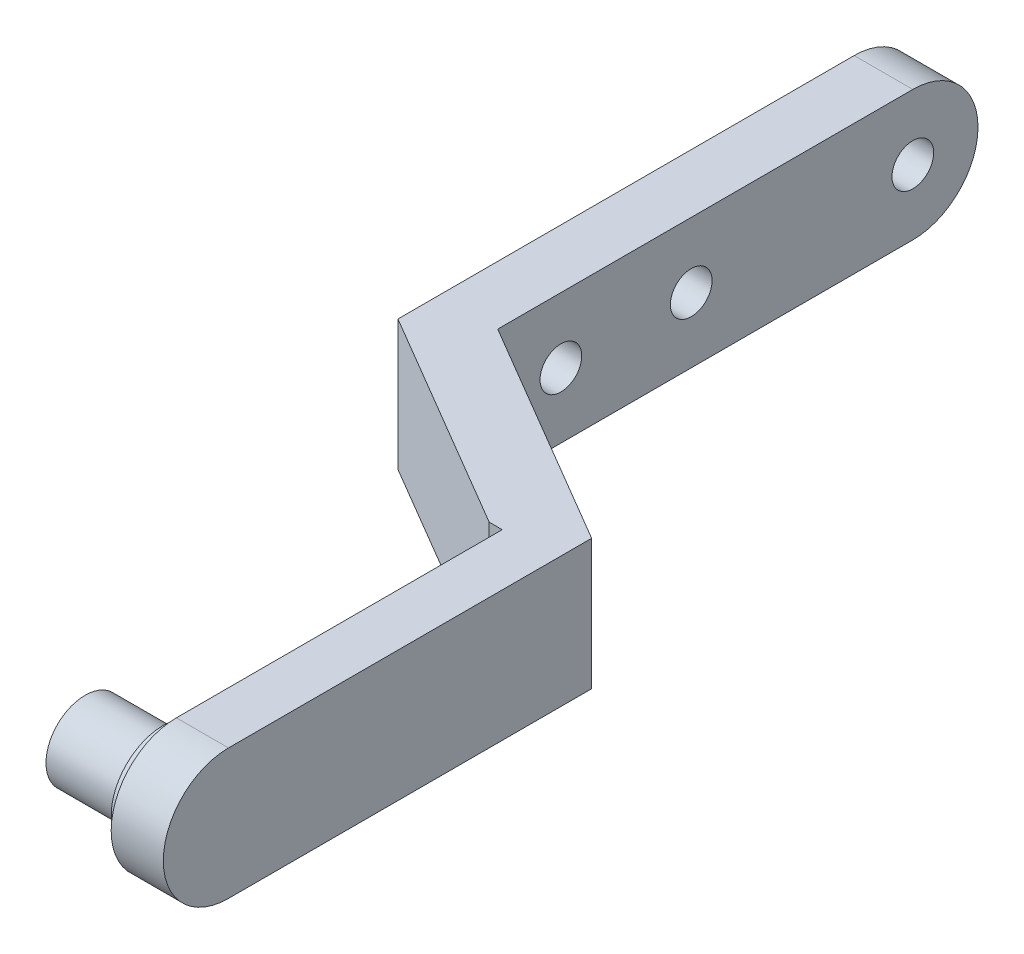
ISO-10303-21;
HEADER;
FILE_DESCRIPTION(('STEP AP214'),'2;1');
FILE_NAME('part.step','',(''),(''),'','','');
FILE_SCHEMA(('AUTOMOTIVE_DESIGN { 1 0 10303 214 1 1 1 1 }'));
ENDSEC;
DATA;
#1=APPLICATION_CONTEXT('core data for automotive mechanical design processes');
#2=APPLICATION_PROTOCOL_DEFINITION('international standard','automotive_design',2000,#1);
#3=PRODUCT_CONTEXT('',#1,'mechanical');
#4=PRODUCT('Part','Part','',(#3));
#5=PRODUCT_RELATED_PRODUCT_CATEGORY('part','',(#4));
#6=PRODUCT_DEFINITION_FORMATION('','',#4);
#7=PRODUCT_DEFINITION_CONTEXT('part definition',#1,'design');
#8=PRODUCT_DEFINITION('design','',#6,#7);
#9=PRODUCT_DEFINITION_SHAPE('','',#8);
#10=(LENGTH_UNIT() NAMED_UNIT(*) SI_UNIT(.MILLI.,.METRE.));
#11=(NAMED_UNIT(*) PLANE_ANGLE_UNIT() SI_UNIT($,.RADIAN.));
#12=(NAMED_UNIT(*) SI_UNIT($,.STERADIAN.) SOLID_ANGLE_UNIT());
#13=UNCERTAINTY_MEASURE_WITH_UNIT(LENGTH_MEASURE(1.E-05),#10,'distance_accuracy_value','');
#14=(GEOMETRIC_REPRESENTATION_CONTEXT(3) GLOBAL_UNCERTAINTY_ASSIGNED_CONTEXT((#13)) GLOBAL_UNIT_ASSIGNED_CONTEXT((#10,
#11,#12)) REPRESENTATION_CONTEXT('',''));
#15=CARTESIAN_POINT('',(0.,0.,0.));
#16=DIRECTION('',(0.,0.,1.));
#17=DIRECTION('',(1.,0.,0.));
#18=AXIS2_PLACEMENT_3D('',#15,#16,#17);
#19=CARTESIAN_POINT('',(0.,5.,-30.));
#20=DIRECTION('',(1.,0.,0.));
#21=DIRECTION('',(0.,0.,-1.));
#22=AXIS2_PLACEMENT_3D('',#19,#20,#21);
#23=PLANE('',#22);
#24=CARTESIAN_POINT('',(0.,0.,-5.));
#25=DIRECTION('',(1.,0.,0.));
#26=DIRECTION('',(0.,0.,-1.));
#27=AXIS2_PLACEMENT_3D('',#24,#25,#26);
#28=CIRCLE('',#27,3.);
#29=CARTESIAN_POINT('',(0.,0.,-8.00000000000001));
#30=VERTEX_POINT('',#29);
#31=EDGE_CURVE('E12',#30,#30,#28,.F.);
#32=ORIENTED_EDGE('',*,*,#31,.F.);
#33=EDGE_LOOP('',(#32));
#34=FACE_BOUND('',#33,.T.);
#35=CARTESIAN_POINT('',(0.,0.,-5.));
#36=DIRECTION('',(1.,0.,0.));
#37=DIRECTION('',(0.,0.,-1.));
#38=AXIS2_PLACEMENT_3D('',#35,#36,#37);
#39=CIRCLE('',#38,4.);
#40=CARTESIAN_POINT('',(0.,0.,-9.00000000000001));
#41=VERTEX_POINT('',#40);
#42=EDGE_CURVE('E50',#41,#41,#39,.F.);
#43=ORIENTED_EDGE('',*,*,#42,.T.);
#44=EDGE_LOOP('',(#43));
#45=FACE_BOUND('',#44,.T.);
#46=ADVANCED_FACE('F46',(#34,#45),#23,.F.);
#47=CARTESIAN_POINT('',(-6.,0.,-5.00000000000001));
#48=DIRECTION('',(1.,0.,0.));
#49=DIRECTION('',(0.,0.,-1.));
#50=AXIS2_PLACEMENT_3D('',#47,#48,#49);
#51=CYLINDRICAL_SURFACE('',#50,3.);
#52=CARTESIAN_POINT('',(-6.,0.,-5.00000000000001));
#53=DIRECTION('',(-1.,0.,0.));
#54=DIRECTION('',(0.,0.,1.));
#55=AXIS2_PLACEMENT_3D('',#52,#53,#54);
#56=CIRCLE('',#55,3.);
#57=CARTESIAN_POINT('',(-6.,0.,-2.));
#58=VERTEX_POINT('',#57);
#59=EDGE_CURVE('E290',#58,#58,#56,.T.);
#60=ORIENTED_EDGE('',*,*,#59,.F.);
#61=EDGE_LOOP('',(#60));
#62=FACE_BOUND('',#61,.T.);
#63=ORIENTED_EDGE('',*,*,#31,.T.);
#64=EDGE_LOOP('',(#63));
#65=FACE_BOUND('',#64,.T.);
#66=ADVANCED_FACE('F239',(#62,#65),#51,.T.);
#67=CARTESIAN_POINT('',(-6.,0.,-5.00000000000001));
#68=DIRECTION('',(-1.,0.,0.));
#69=DIRECTION('',(0.,0.,1.));
#70=AXIS2_PLACEMENT_3D('',#67,#68,#69);
#71=PLANE('',#70);
#72=ORIENTED_EDGE('',*,*,#59,.T.);
#73=EDGE_LOOP('',(#72));
#74=FACE_BOUND('',#73,.T.);
#75=ADVANCED_FACE('F247',(#74),#71,.T.);
#76=CARTESIAN_POINT('',(-17.0000000000001,0.,-5.00000000000001));
#77=DIRECTION('',(1.,0.,0.));
#78=DIRECTION('',(0.,0.,-1.));
#79=AXIS2_PLACEMENT_3D('',#76,#77,#78);
#80=CYLINDRICAL_SURFACE('',#79,4.);
#81=CARTESIAN_POINT('',(1.,0.,-5.));
#82=DIRECTION('',(-1.,0.,0.));
#83=DIRECTION('',(0.,0.,1.));
#84=AXIS2_PLACEMENT_3D('',#81,#82,#83);
#85=CIRCLE('',#84,4.);
#86=CARTESIAN_POINT('',(1.,0.,-1.));
#87=VERTEX_POINT('',#86);
#88=EDGE_CURVE('E128',#87,#87,#85,.T.);
#89=ORIENTED_EDGE('',*,*,#88,.T.);
#90=EDGE_LOOP('',(#89));
#91=FACE_BOUND('',#90,.T.);
#92=ORIENTED_EDGE('',*,*,#42,.F.);
#93=EDGE_LOOP('',(#92));
#94=FACE_BOUND('',#93,.T.);
#95=ADVANCED_FACE('F352',(#91,#94),#80,.T.);
#96=CARTESIAN_POINT('',(-17.0000000000001,5.,-30.));
#97=DIRECTION('',(0.,0.,1.));
#98=DIRECTION('',(1.,0.,0.));
#99=AXIS2_PLACEMENT_3D('',#96,#97,#98);
#100=PLANE('',#99);
#101=DIRECTION('',(0.,-1.,0.));
#102=VECTOR('',#101,1.);
#103=CARTESIAN_POINT('',(0.,5.,-30.));
#104=LINE('',#103,#102);
#105=CARTESIAN_POINT('',(0.,5.,-30.));
#106=VERTEX_POINT('',#105);
#107=CARTESIAN_POINT('',(0.,-5.,-30.));
#108=VERTEX_POINT('',#107);
#109=EDGE_CURVE('E196',#106,#108,#104,.T.);
#110=ORIENTED_EDGE('',*,*,#109,.T.);
#111=DIRECTION('',(1.,0.,0.));
#112=VECTOR('',#111,1.);
#113=CARTESIAN_POINT('',(-17.0000000000001,-5.,-30.));
#114=LINE('',#113,#112);
#115=CARTESIAN_POINT('',(1.,-5.,-30.));
#116=VERTEX_POINT('',#115);
#117=EDGE_CURVE('E280',#108,#116,#114,.T.);
#118=ORIENTED_EDGE('',*,*,#117,.T.);
#119=DIRECTION('',(0.,-1.,0.));
#120=VECTOR('',#119,1.);
#121=CARTESIAN_POINT('',(1.,5.,-30.));
#122=LINE('',#121,#120);
#123=CARTESIAN_POINT('',(1.,5.,-30.));
#124=VERTEX_POINT('',#123);
#125=EDGE_CURVE('E137',#124,#116,#122,.T.);
#126=ORIENTED_EDGE('',*,*,#125,.F.);
#127=DIRECTION('',(1.,0.,0.));
#128=VECTOR('',#127,1.);
#129=CARTESIAN_POINT('',(-17.0000000000001,5.,-30.));
#130=LINE('',#129,#128);
#131=EDGE_CURVE('E135',#106,#124,#130,.T.);
#132=ORIENTED_EDGE('',*,*,#131,.F.);
#133=EDGE_LOOP('',(#110,#118,#126,#132));
#134=FACE_BOUND('',#133,.T.);
#135=ADVANCED_FACE('F284',(#134),#100,.T.);
#136=CARTESIAN_POINT('',(1.,0.,-5.));
#137=DIRECTION('',(-1.,0.,0.));
#138=DIRECTION('',(0.,0.,1.));
#139=AXIS2_PLACEMENT_3D('',#136,#137,#138);
#140=PLANE('',#139);
#141=ORIENTED_EDGE('',*,*,#88,.F.);
#142=EDGE_LOOP('',(#141));
#143=FACE_BOUND('',#142,.T.);
#144=CARTESIAN_POINT('',(1.,0.,-5.));
#145=DIRECTION('',(-1.,0.,0.));
#146=DIRECTION('',(0.,0.,1.));
#147=AXIS2_PLACEMENT_3D('',#144,#145,#146);
#148=CIRCLE('',#147,5.);
#149=CARTESIAN_POINT('',(1.,-5.,-5.));
#150=VERTEX_POINT('',#149);
#151=CARTESIAN_POINT('',(1.,5.,-5.));
#152=VERTEX_POINT('',#151);
#153=EDGE_CURVE('E119',#150,#152,#148,.T.);
#154=ORIENTED_EDGE('',*,*,#153,.T.);
#155=DIRECTION('',(0.,0.,-1.));
#156=VECTOR('',#155,1.);
#157=CARTESIAN_POINT('',(1.,5.,-5.));
#158=LINE('',#157,#156);
#159=EDGE_CURVE('E122',#152,#124,#158,.T.);
#160=ORIENTED_EDGE('',*,*,#159,.T.);
#161=ORIENTED_EDGE('',*,*,#125,.T.);
#162=DIRECTION('',(0.,0.,1.));
#163=VECTOR('',#162,1.);
#164=CARTESIAN_POINT('',(1.,-5.,-30.));
#165=LINE('',#164,#163);
#166=EDGE_CURVE('E63',#116,#150,#165,.T.);
#167=ORIENTED_EDGE('',*,*,#166,.T.);
#168=EDGE_LOOP('',(#154,#160,#161,#167));
#169=FACE_BOUND('',#168,.T.);
#170=ADVANCED_FACE('F121',(#143,#169),#140,.T.);
#171=CARTESIAN_POINT('',(-17.,0.,-48.));
#172=DIRECTION('',(1.,0.,0.));
#173=DIRECTION('',(0.,0.,-1.));
#174=AXIS2_PLACEMENT_3D('',#171,#172,#173);
#175=CYLINDRICAL_SURFACE('',#174,1.6);
#176=CARTESIAN_POINT('',(-17.,0.,-48.));
#177=DIRECTION('',(1.,0.,0.));
#178=DIRECTION('',(0.,0.,-1.));
#179=AXIS2_PLACEMENT_3D('',#176,#177,#178);
#180=CIRCLE('',#179,1.6);
#181=CARTESIAN_POINT('',(-17.,0.,-49.6));
#182=VERTEX_POINT('',#181);
#183=EDGE_CURVE('E274',#182,#182,#180,.T.);
#184=CARTESIAN_POINT('',(-12.5,0.,-48.));
#185=DIRECTION('',(-1.,0.,0.));
#186=DIRECTION('',(0.,0.,1.));
#187=AXIS2_PLACEMENT_3D('',#184,#185,#186);
#188=CIRCLE('',#187,1.6);
#189=CARTESIAN_POINT('',(-12.5,0.,-49.6));
#190=VERTEX_POINT('',#189);
#191=EDGE_CURVE('E299',#190,#190,#188,.T.);
#192=CARTESIAN_POINT('',(-17.,0.,-49.6));
#193=CARTESIAN_POINT('',(-16.953125,0.,-49.6));
#194=CARTESIAN_POINT('',(-16.90625,0.,-49.6));
#195=CARTESIAN_POINT('',(-16.8125,0.,-49.6));
#196=CARTESIAN_POINT('',(-16.765625,0.,-49.6));
#197=CARTESIAN_POINT('',(-16.671875,0.,-49.6));
#198=CARTESIAN_POINT('',(-16.625,0.,-49.6));
#199=CARTESIAN_POINT('',(-16.53125,0.,-49.6));
#200=CARTESIAN_POINT('',(-16.484375,0.,-49.6));
#201=CARTESIAN_POINT('',(-16.390625,0.,-49.6));
#202=CARTESIAN_POINT('',(-16.34375,0.,-49.6));
#203=CARTESIAN_POINT('',(-16.25,0.,-49.6));
#204=CARTESIAN_POINT('',(-16.203125,0.,-49.6));
#205=CARTESIAN_POINT('',(-16.109375,0.,-49.6));
#206=CARTESIAN_POINT('',(-16.0625,0.,-49.6));
#207=CARTESIAN_POINT('',(-15.96875,0.,-49.6));
#208=CARTESIAN_POINT('',(-15.921875,0.,-49.6));
#209=CARTESIAN_POINT('',(-15.828125,0.,-49.6));
#210=CARTESIAN_POINT('',(-15.78125,0.,-49.6));
#211=CARTESIAN_POINT('',(-15.6875,0.,-49.6));
#212=CARTESIAN_POINT('',(-15.640625,0.,-49.6));
#213=CARTESIAN_POINT('',(-15.546875,0.,-49.6));
#214=CARTESIAN_POINT('',(-15.5,0.,-49.6));
#215=CARTESIAN_POINT('',(-15.40625,0.,-49.6));
#216=CARTESIAN_POINT('',(-15.359375,0.,-49.6));
#217=CARTESIAN_POINT('',(-15.265625,0.,-49.6));
#218=CARTESIAN_POINT('',(-15.21875,0.,-49.6));
#219=CARTESIAN_POINT('',(-15.125,0.,-49.6));
#220=CARTESIAN_POINT('',(-15.078125,0.,-49.6));
#221=CARTESIAN_POINT('',(-14.984375,0.,-49.6));
#222=CARTESIAN_POINT('',(-14.9375,0.,-49.6));
#223=CARTESIAN_POINT('',(-14.84375,0.,-49.6));
#224=CARTESIAN_POINT('',(-14.796875,0.,-49.6));
#225=CARTESIAN_POINT('',(-14.703125,0.,-49.6));
#226=CARTESIAN_POINT('',(-14.65625,0.,-49.6));
#227=CARTESIAN_POINT('',(-14.5625,0.,-49.6));
#228=CARTESIAN_POINT('',(-14.515625,0.,-49.6));
#229=CARTESIAN_POINT('',(-14.421875,0.,-49.6));
#230=CARTESIAN_POINT('',(-14.375,0.,-49.6));
#231=CARTESIAN_POINT('',(-14.28125,0.,-49.6));
#232=CARTESIAN_POINT('',(-14.234375,0.,-49.6));
#233=CARTESIAN_POINT('',(-14.140625,0.,-49.6));
#234=CARTESIAN_POINT('',(-14.09375,0.,-49.6));
#235=CARTESIAN_POINT('',(-14.,0.,-49.6));
#236=CARTESIAN_POINT('',(-13.953125,0.,-49.6));
#237=CARTESIAN_POINT('',(-13.859375,0.,-49.6));
#238=CARTESIAN_POINT('',(-13.8125,0.,-49.6));
#239=CARTESIAN_POINT('',(-13.71875,0.,-49.6));
#240=CARTESIAN_POINT('',(-13.671875,0.,-49.6));
#241=CARTESIAN_POINT('',(-13.578125,0.,-49.6));
#242=CARTESIAN_POINT('',(-13.53125,0.,-49.6));
#243=CARTESIAN_POINT('',(-13.4375,0.,-49.6));
#244=CARTESIAN_POINT('',(-13.390625,0.,-49.6));
#245=CARTESIAN_POINT('',(-13.296875,0.,-49.6));
#246=CARTESIAN_POINT('',(-13.25,0.,-49.6));
#247=CARTESIAN_POINT('',(-13.15625,0.,-49.6));
#248=CARTESIAN_POINT('',(-13.109375,0.,-49.6));
#249=CARTESIAN_POINT('',(-13.015625,0.,-49.6));
#250=CARTESIAN_POINT('',(-12.96875,0.,-49.6));
#251=CARTESIAN_POINT('',(-12.875,0.,-49.6));
#252=CARTESIAN_POINT('',(-12.828125,0.,-49.6));
#253=CARTESIAN_POINT('',(-12.734375,0.,-49.6));
#254=CARTESIAN_POINT('',(-12.6875,0.,-49.6));
#255=CARTESIAN_POINT('',(-12.59375,0.,-49.6));
#256=CARTESIAN_POINT('',(-12.546875,0.,-49.6));
#257=CARTESIAN_POINT('',(-12.5,0.,-49.6));
#258=B_SPLINE_CURVE_WITH_KNOTS('',3,(#192,#193,#194,#195,#196,#197,#198,#199,#200,#201,#202,
#203,#204,#205,#206,#207,#208,#209,#210,#211,#212,#213,#214,#215,#216,#217,#218,#219,#220,#221,
#222,#223,#224,#225,#226,#227,#228,#229,#230,#231,#232,#233,#234,#235,#236,#237,#238,#239,#240,
#241,#242,#243,#244,#245,#246,#247,#248,#249,#250,#251,#252,#253,#254,#255,#256,#257),
.UNSPECIFIED.,.F.,.F.,(4,2,2,2,2,2,2,2,2,2,2,2,2,2,2,2,2,2,2,2,2,2,2,2,2,2,2,2,2,2,2,2,4),(0.,
0.140624999999998,0.28125,0.421875000000002,0.562500000000004,0.703125000000006,
0.843750000000004,0.984375000000006,1.12500000000001,1.26562500000001,1.40625000000001,
1.54687500000001,1.68750000000001,1.82812500000001,1.96875000000002,2.10937500000002,
2.25000000000002,2.39062500000002,2.53125000000002,2.67187500000002,2.81250000000002,
2.95312500000003,3.09375000000003,3.23437500000003,3.37500000000003,3.51562500000003,
3.65625000000003,3.79687500000003,3.93750000000003,4.07812500000003,4.21875000000003,
4.35937500000004,4.50000000000004),.UNSPECIFIED.);
#259=EDGE_CURVE('BSEAM321',#182,#190,#258,.T.);
#260=ORIENTED_EDGE('',*,*,#183,.F.);
#261=ORIENTED_EDGE('',*,*,#191,.F.);
#262=ORIENTED_EDGE('',*,*,#259,.T.);
#263=ORIENTED_EDGE('',*,*,#259,.F.);
#264=EDGE_LOOP('',(#260,#262,#261,#263));
#265=FACE_BOUND('',#264,.T.);
#266=ADVANCED_FACE('F321',(#265),#175,.F.);
#267=CARTESIAN_POINT('',(-17.,0.,-58.));
#268=DIRECTION('',(1.,0.,0.));
#269=DIRECTION('',(0.,0.,-1.));
#270=AXIS2_PLACEMENT_3D('',#267,#268,#269);
#271=CYLINDRICAL_SURFACE('',#270,1.60000000000001);
#272=CARTESIAN_POINT('',(-17.,0.,-58.));
#273=DIRECTION('',(1.,0.,0.));
#274=DIRECTION('',(0.,0.,-1.));
#275=AXIS2_PLACEMENT_3D('',#272,#273,#274);
#276=CIRCLE('',#275,1.60000000000001);
#277=CARTESIAN_POINT('',(-17.,0.,-59.6));
#278=VERTEX_POINT('',#277);
#279=EDGE_CURVE('E270',#278,#278,#276,.T.);
#280=CARTESIAN_POINT('',(-12.5,0.,-58.));
#281=DIRECTION('',(-1.,0.,0.));
#282=DIRECTION('',(0.,0.,1.));
#283=AXIS2_PLACEMENT_3D('',#280,#281,#282);
#284=CIRCLE('',#283,1.60000000000001);
#285=CARTESIAN_POINT('',(-12.5,0.,-59.6));
#286=VERTEX_POINT('',#285);
#287=EDGE_CURVE('E307',#286,#286,#284,.T.);
#288=CARTESIAN_POINT('',(-17.,0.,-59.6));
#289=CARTESIAN_POINT('',(-16.953125,0.,-59.6));
#290=CARTESIAN_POINT('',(-16.90625,0.,-59.6));
#291=CARTESIAN_POINT('',(-16.8125,0.,-59.6));
#292=CARTESIAN_POINT('',(-16.765625,0.,-59.6));
#293=CARTESIAN_POINT('',(-16.671875,0.,-59.6));
#294=CARTESIAN_POINT('',(-16.625,0.,-59.6));
#295=CARTESIAN_POINT('',(-16.53125,0.,-59.6));
#296=CARTESIAN_POINT('',(-16.484375,0.,-59.6));
#297=CARTESIAN_POINT('',(-16.390625,0.,-59.6));
#298=CARTESIAN_POINT('',(-16.34375,0.,-59.6));
#299=CARTESIAN_POINT('',(-16.25,0.,-59.6));
#300=CARTESIAN_POINT('',(-16.203125,0.,-59.6));
#301=CARTESIAN_POINT('',(-16.109375,0.,-59.6));
#302=CARTESIAN_POINT('',(-16.0625,0.,-59.6));
#303=CARTESIAN_POINT('',(-15.96875,0.,-59.6));
#304=CARTESIAN_POINT('',(-15.921875,0.,-59.6));
#305=CARTESIAN_POINT('',(-15.828125,0.,-59.6));
#306=CARTESIAN_POINT('',(-15.78125,0.,-59.6));
#307=CARTESIAN_POINT('',(-15.6875,0.,-59.6));
#308=CARTESIAN_POINT('',(-15.640625,0.,-59.6));
#309=CARTESIAN_POINT('',(-15.546875,0.,-59.6));
#310=CARTESIAN_POINT('',(-15.5,0.,-59.6));
#311=CARTESIAN_POINT('',(-15.40625,0.,-59.6));
#312=CARTESIAN_POINT('',(-15.359375,0.,-59.6));
#313=CARTESIAN_POINT('',(-15.265625,0.,-59.6));
#314=CARTESIAN_POINT('',(-15.21875,0.,-59.6));
#315=CARTESIAN_POINT('',(-15.125,0.,-59.6));
#316=CARTESIAN_POINT('',(-15.078125,0.,-59.6));
#317=CARTESIAN_POINT('',(-14.984375,0.,-59.6));
#318=CARTESIAN_POINT('',(-14.9375,0.,-59.6));
#319=CARTESIAN_POINT('',(-14.84375,0.,-59.6));
#320=CARTESIAN_POINT('',(-14.796875,0.,-59.6));
#321=CARTESIAN_POINT('',(-14.703125,0.,-59.6));
#322=CARTESIAN_POINT('',(-14.65625,0.,-59.6));
#323=CARTESIAN_POINT('',(-14.5625,0.,-59.6));
#324=CARTESIAN_POINT('',(-14.515625,0.,-59.6));
#325=CARTESIAN_POINT('',(-14.421875,0.,-59.6));
#326=CARTESIAN_POINT('',(-14.375,0.,-59.6));
#327=CARTESIAN_POINT('',(-14.28125,0.,-59.6));
#328=CARTESIAN_POINT('',(-14.234375,0.,-59.6));
#329=CARTESIAN_POINT('',(-14.140625,0.,-59.6));
#330=CARTESIAN_POINT('',(-14.09375,0.,-59.6));
#331=CARTESIAN_POINT('',(-14.,0.,-59.6));
#332=CARTESIAN_POINT('',(-13.953125,0.,-59.6));
#333=CARTESIAN_POINT('',(-13.859375,0.,-59.6));
#334=CARTESIAN_POINT('',(-13.8125,0.,-59.6));
#335=CARTESIAN_POINT('',(-13.71875,0.,-59.6));
#336=CARTESIAN_POINT('',(-13.671875,0.,-59.6));
#337=CARTESIAN_POINT('',(-13.578125,0.,-59.6));
#338=CARTESIAN_POINT('',(-13.53125,0.,-59.6));
#339=CARTESIAN_POINT('',(-13.4375,0.,-59.6));
#340=CARTESIAN_POINT('',(-13.390625,0.,-59.6));
#341=CARTESIAN_POINT('',(-13.296875,0.,-59.6));
#342=CARTESIAN_POINT('',(-13.25,0.,-59.6));
#343=CARTESIAN_POINT('',(-13.15625,0.,-59.6));
#344=CARTESIAN_POINT('',(-13.109375,0.,-59.6));
#345=CARTESIAN_POINT('',(-13.015625,0.,-59.6));
#346=CARTESIAN_POINT('',(-12.96875,0.,-59.6));
#347=CARTESIAN_POINT('',(-12.875,0.,-59.6));
#348=CARTESIAN_POINT('',(-12.828125,0.,-59.6));
#349=CARTESIAN_POINT('',(-12.734375,0.,-59.6));
#350=CARTESIAN_POINT('',(-12.6875,0.,-59.6));
#351=CARTESIAN_POINT('',(-12.59375,0.,-59.6));
#352=CARTESIAN_POINT('',(-12.546875,0.,-59.6));
#353=CARTESIAN_POINT('',(-12.5,0.,-59.6));
#354=B_SPLINE_CURVE_WITH_KNOTS('',3,(#288,#289,#290,#291,#292,#293,#294,#295,#296,#297,#298,
#299,#300,#301,#302,#303,#304,#305,#306,#307,#308,#309,#310,#311,#312,#313,#314,#315,#316,#317,
#318,#319,#320,#321,#322,#323,#324,#325,#326,#327,#328,#329,#330,#331,#332,#333,#334,#335,#336,
#337,#338,#339,#340,#341,#342,#343,#344,#345,#346,#347,#348,#349,#350,#351,#352,#353),
.UNSPECIFIED.,.F.,.F.,(4,2,2,2,2,2,2,2,2,2,2,2,2,2,2,2,2,2,2,2,2,2,2,2,2,2,2,2,2,2,2,2,4),(0.,
0.140624999999998,0.28125,0.421875000000002,0.562500000000004,0.703125000000006,
0.843750000000004,0.984375000000006,1.12500000000001,1.26562500000001,1.40625000000001,
1.54687500000001,1.68750000000001,1.82812500000001,1.96875000000002,2.10937500000002,
2.25000000000002,2.39062500000002,2.53125000000002,2.67187500000002,2.81250000000002,
2.95312500000003,3.09375000000003,3.23437500000003,3.37500000000003,3.51562500000003,
3.65625000000003,3.79687500000003,3.93750000000003,4.07812500000003,4.21875000000003,
4.35937500000004,4.50000000000004),.UNSPECIFIED.);
#355=EDGE_CURVE('BSEAM315',#278,#286,#354,.T.);
#356=ORIENTED_EDGE('',*,*,#279,.F.);
#357=ORIENTED_EDGE('',*,*,#287,.F.);
#358=ORIENTED_EDGE('',*,*,#355,.T.);
#359=ORIENTED_EDGE('',*,*,#355,.F.);
#360=EDGE_LOOP('',(#356,#358,#357,#359));
#361=FACE_BOUND('',#360,.T.);
#362=ADVANCED_FACE('F315',(#361),#271,.F.);
#363=CARTESIAN_POINT('',(-17.,0.,-75.));
#364=DIRECTION('',(1.,0.,0.));
#365=DIRECTION('',(0.,0.,-1.));
#366=AXIS2_PLACEMENT_3D('',#363,#364,#365);
#367=CYLINDRICAL_SURFACE('',#366,1.60000000000001);
#368=CARTESIAN_POINT('',(-17.,0.,-75.));
#369=DIRECTION('',(1.,0.,0.));
#370=DIRECTION('',(0.,0.,-1.));
#371=AXIS2_PLACEMENT_3D('',#368,#369,#370);
#372=CIRCLE('',#371,1.60000000000001);
#373=CARTESIAN_POINT('',(-17.,0.,-76.6));
#374=VERTEX_POINT('',#373);
#375=EDGE_CURVE('E266',#374,#374,#372,.T.);
#376=CARTESIAN_POINT('',(-12.5,0.,-75.));
#377=DIRECTION('',(-1.,0.,0.));
#378=DIRECTION('',(0.,0.,1.));
#379=AXIS2_PLACEMENT_3D('',#376,#377,#378);
#380=CIRCLE('',#379,1.60000000000001);
#381=CARTESIAN_POINT('',(-12.5,0.,-76.6));
#382=VERTEX_POINT('',#381);
#383=EDGE_CURVE('E214',#382,#382,#380,.T.);
#384=CARTESIAN_POINT('',(-17.,0.,-76.6));
#385=CARTESIAN_POINT('',(-16.953125,0.,-76.6));
#386=CARTESIAN_POINT('',(-16.90625,0.,-76.6));
#387=CARTESIAN_POINT('',(-16.8125,0.,-76.6));
#388=CARTESIAN_POINT('',(-16.765625,0.,-76.6));
#389=CARTESIAN_POINT('',(-16.671875,0.,-76.6));
#390=CARTESIAN_POINT('',(-16.625,0.,-76.6));
#391=CARTESIAN_POINT('',(-16.53125,0.,-76.6));
#392=CARTESIAN_POINT('',(-16.484375,0.,-76.6));
#393=CARTESIAN_POINT('',(-16.390625,0.,-76.6));
#394=CARTESIAN_POINT('',(-16.34375,0.,-76.6));
#395=CARTESIAN_POINT('',(-16.25,0.,-76.6));
#396=CARTESIAN_POINT('',(-16.203125,0.,-76.6));
#397=CARTESIAN_POINT('',(-16.109375,0.,-76.6));
#398=CARTESIAN_POINT('',(-16.0625,0.,-76.6));
#399=CARTESIAN_POINT('',(-15.96875,0.,-76.6));
#400=CARTESIAN_POINT('',(-15.921875,0.,-76.6));
#401=CARTESIAN_POINT('',(-15.828125,0.,-76.6));
#402=CARTESIAN_POINT('',(-15.78125,0.,-76.6));
#403=CARTESIAN_POINT('',(-15.6875,0.,-76.6));
#404=CARTESIAN_POINT('',(-15.640625,0.,-76.6));
#405=CARTESIAN_POINT('',(-15.546875,0.,-76.6));
#406=CARTESIAN_POINT('',(-15.5,0.,-76.6));
#407=CARTESIAN_POINT('',(-15.40625,0.,-76.6));
#408=CARTESIAN_POINT('',(-15.359375,0.,-76.6));
#409=CARTESIAN_POINT('',(-15.265625,0.,-76.6));
#410=CARTESIAN_POINT('',(-15.21875,0.,-76.6));
#411=CARTESIAN_POINT('',(-15.125,0.,-76.6));
#412=CARTESIAN_POINT('',(-15.078125,0.,-76.6));
#413=CARTESIAN_POINT('',(-14.984375,0.,-76.6));
#414=CARTESIAN_POINT('',(-14.9375,0.,-76.6));
#415=CARTESIAN_POINT('',(-14.84375,0.,-76.6));
#416=CARTESIAN_POINT('',(-14.796875,0.,-76.6));
#417=CARTESIAN_POINT('',(-14.703125,0.,-76.6));
#418=CARTESIAN_POINT('',(-14.65625,0.,-76.6));
#419=CARTESIAN_POINT('',(-14.5625,0.,-76.6));
#420=CARTESIAN_POINT('',(-14.515625,0.,-76.6));
#421=CARTESIAN_POINT('',(-14.421875,0.,-76.6));
#422=CARTESIAN_POINT('',(-14.375,0.,-76.6));
#423=CARTESIAN_POINT('',(-14.28125,0.,-76.6));
#424=CARTESIAN_POINT('',(-14.234375,0.,-76.6));
#425=CARTESIAN_POINT('',(-14.140625,0.,-76.6));
#426=CARTESIAN_POINT('',(-14.09375,0.,-76.6));
#427=CARTESIAN_POINT('',(-14.,0.,-76.6));
#428=CARTESIAN_POINT('',(-13.953125,0.,-76.6));
#429=CARTESIAN_POINT('',(-13.859375,0.,-76.6));
#430=CARTESIAN_POINT('',(-13.8125,0.,-76.6));
#431=CARTESIAN_POINT('',(-13.71875,0.,-76.6));
#432=CARTESIAN_POINT('',(-13.671875,0.,-76.6));
#433=CARTESIAN_POINT('',(-13.578125,0.,-76.6));
#434=CARTESIAN_POINT('',(-13.53125,0.,-76.6));
#435=CARTESIAN_POINT('',(-13.4375,0.,-76.6));
#436=CARTESIAN_POINT('',(-13.390625,0.,-76.6));
#437=CARTESIAN_POINT('',(-13.296875,0.,-76.6));
#438=CARTESIAN_POINT('',(-13.25,0.,-76.6));
#439=CARTESIAN_POINT('',(-13.15625,0.,-76.6));
#440=CARTESIAN_POINT('',(-13.109375,0.,-76.6));
#441=CARTESIAN_POINT('',(-13.015625,0.,-76.6));
#442=CARTESIAN_POINT('',(-12.96875,0.,-76.6));
#443=CARTESIAN_POINT('',(-12.875,0.,-76.6));
#444=CARTESIAN_POINT('',(-12.828125,0.,-76.6));
#445=CARTESIAN_POINT('',(-12.734375,0.,-76.6));
#446=CARTESIAN_POINT('',(-12.6875,0.,-76.6));
#447=CARTESIAN_POINT('',(-12.59375,0.,-76.6));
#448=CARTESIAN_POINT('',(-12.546875,0.,-76.6));
#449=CARTESIAN_POINT('',(-12.5,0.,-76.6));
#450=B_SPLINE_CURVE_WITH_KNOTS('',3,(#384,#385,#386,#387,#388,#389,#390,#391,#392,#393,#394,
#395,#396,#397,#398,#399,#400,#401,#402,#403,#404,#405,#406,#407,#408,#409,#410,#411,#412,#413,
#414,#415,#416,#417,#418,#419,#420,#421,#422,#423,#424,#425,#426,#427,#428,#429,#430,#431,#432,
#433,#434,#435,#436,#437,#438,#439,#440,#441,#442,#443,#444,#445,#446,#447,#448,#449),
.UNSPECIFIED.,.F.,.F.,(4,2,2,2,2,2,2,2,2,2,2,2,2,2,2,2,2,2,2,2,2,2,2,2,2,2,2,2,2,2,2,2,4),(0.,
0.140624999999998,0.28125,0.421875000000002,0.562500000000004,0.703125000000006,
0.843750000000004,0.984375000000006,1.12500000000001,1.26562500000001,1.40625000000001,
1.54687500000001,1.68750000000001,1.82812500000001,1.96875000000002,2.10937500000002,
2.25000000000002,2.39062500000002,2.53125000000002,2.67187500000002,2.81250000000002,
2.95312500000003,3.09375000000003,3.23437500000003,3.37500000000003,3.51562500000003,
3.65625000000003,3.79687500000003,3.93750000000003,4.07812500000003,4.21875000000003,
4.35937500000004,4.50000000000004),.UNSPECIFIED.);
#451=EDGE_CURVE('BSEAM234',#374,#382,#450,.T.);
#452=ORIENTED_EDGE('',*,*,#375,.F.);
#453=ORIENTED_EDGE('',*,*,#383,.F.);
#454=ORIENTED_EDGE('',*,*,#451,.T.);
#455=ORIENTED_EDGE('',*,*,#451,.F.);
#456=EDGE_LOOP('',(#452,#454,#453,#455));
#457=FACE_BOUND('',#456,.T.);
#458=ADVANCED_FACE('F234',(#457),#367,.F.);
#459=CARTESIAN_POINT('',(-12.5,5.,-43.1538479186224));
#460=DIRECTION('',(-0.507020126563393,0.,0.86193421515777));
#461=DIRECTION('',(0.86193421515777,0.,0.507020126563393));
#462=AXIS2_PLACEMENT_3D('',#459,#460,#461);
#463=PLANE('',#462);
#464=DIRECTION('',(-0.86193421515777,0.,-0.507020126563393));
#465=VECTOR('',#464,1.);
#466=CARTESIAN_POINT('',(-12.5,-5.,-43.1538479186224));
#467=LINE('',#466,#465);
#468=CARTESIAN_POINT('',(5.,-5.,-32.8597302715635));
#469=VERTEX_POINT('',#468);
#470=CARTESIAN_POINT('',(-12.5,-5.,-43.1538479186224));
#471=VERTEX_POINT('',#470);
#472=EDGE_CURVE('E148',#469,#471,#467,.T.);
#473=ORIENTED_EDGE('',*,*,#472,.T.);
#474=DIRECTION('',(0.,-1.,0.));
#475=VECTOR('',#474,1.);
#476=CARTESIAN_POINT('',(-12.5,5.,-43.1538479186224));
#477=LINE('',#476,#475);
#478=CARTESIAN_POINT('',(-12.5,5.,-43.1538479186224));
#479=VERTEX_POINT('',#478);
#480=EDGE_CURVE('E203',#479,#471,#477,.T.);
#481=ORIENTED_EDGE('',*,*,#480,.F.);
#482=DIRECTION('',(-0.86193421515777,0.,-0.507020126563393));
#483=VECTOR('',#482,1.);
#484=CARTESIAN_POINT('',(-12.5,5.,-43.1538479186224));
#485=LINE('',#484,#483);
#486=CARTESIAN_POINT('',(5.,5.,-32.8597302715635));
#487=VERTEX_POINT('',#486);
#488=EDGE_CURVE('E158',#487,#479,#485,.T.);
#489=ORIENTED_EDGE('',*,*,#488,.F.);
#490=DIRECTION('',(0.,-1.,0.));
#491=VECTOR('',#490,1.);
#492=CARTESIAN_POINT('',(5.,5.,-32.8597302715635));
#493=LINE('',#492,#491);
#494=EDGE_CURVE('E176',#487,#469,#493,.T.);
#495=ORIENTED_EDGE('',*,*,#494,.T.);
#496=EDGE_LOOP('',(#473,#481,#489,#495));
#497=FACE_BOUND('',#496,.T.);
#498=ADVANCED_FACE('F48',(#497),#463,.F.);
#499=CARTESIAN_POINT('',(-12.5,5.,-80.));
#500=DIRECTION('',(-1.,0.,0.));
#501=DIRECTION('',(0.,0.,1.));
#502=AXIS2_PLACEMENT_3D('',#499,#500,#501);
#503=PLANE('',#502);
#504=ORIENTED_EDGE('',*,*,#383,.T.);
#505=EDGE_LOOP('',(#504));
#506=FACE_BOUND('',#505,.T.);
#507=ORIENTED_EDGE('',*,*,#287,.T.);
#508=EDGE_LOOP('',(#507));
#509=FACE_BOUND('',#508,.T.);
#510=ORIENTED_EDGE('',*,*,#191,.T.);
#511=EDGE_LOOP('',(#510));
#512=FACE_BOUND('',#511,.T.);
#513=CARTESIAN_POINT('',(-12.5,0.,-75.));
#514=DIRECTION('',(-1.,0.,0.));
#515=DIRECTION('',(0.,0.,1.));
#516=AXIS2_PLACEMENT_3D('',#513,#514,#515);
#517=CIRCLE('',#516,5.);
#518=CARTESIAN_POINT('',(-12.5,5.,-75.));
#519=VERTEX_POINT('',#518);
#520=CARTESIAN_POINT('',(-12.5,-5.,-75.));
#521=VERTEX_POINT('',#520);
#522=EDGE_CURVE('E71',#519,#521,#517,.T.);
#523=ORIENTED_EDGE('',*,*,#522,.F.);
#524=DIRECTION('',(0.,0.,-1.));
#525=VECTOR('',#524,1.);
#526=CARTESIAN_POINT('',(-12.5,5.,-80.));
#527=LINE('',#526,#525);
#528=EDGE_CURVE('E162',#479,#519,#527,.T.);
#529=ORIENTED_EDGE('',*,*,#528,.F.);
#530=ORIENTED_EDGE('',*,*,#480,.T.);
#531=DIRECTION('',(0.,0.,-1.));
#532=VECTOR('',#531,1.);
#533=CARTESIAN_POINT('',(-12.5,-5.,-80.));
#534=LINE('',#533,#532);
#535=EDGE_CURVE('E180',#471,#521,#534,.T.);
#536=ORIENTED_EDGE('',*,*,#535,.T.);
#537=EDGE_LOOP('',(#523,#529,#530,#536));
#538=FACE_BOUND('',#537,.T.);
#539=ADVANCED_FACE('F223',(#506,#509,#512,#538),#503,.F.);
#540=CARTESIAN_POINT('',(-17.,0.,-75.));
#541=DIRECTION('',(1.,0.,0.));
#542=DIRECTION('',(0.,0.,-1.));
#543=AXIS2_PLACEMENT_3D('',#540,#541,#542);
#544=CYLINDRICAL_SURFACE('',#543,5.);
#545=ORIENTED_EDGE('',*,*,#522,.T.);
#546=DIRECTION('',(1.,0.,0.));
#547=VECTOR('',#546,1.);
#548=CARTESIAN_POINT('',(-17.,-5.,-75.));
#549=LINE('',#548,#547);
#550=CARTESIAN_POINT('',(-17.,-5.,-75.));
#551=VERTEX_POINT('',#550);
#552=EDGE_CURVE('E150',#551,#521,#549,.T.);
#553=ORIENTED_EDGE('',*,*,#552,.F.);
#554=CARTESIAN_POINT('',(-17.,0.,-75.));
#555=DIRECTION('',(1.,0.,0.));
#556=DIRECTION('',(0.,0.,-1.));
#557=AXIS2_PLACEMENT_3D('',#554,#555,#556);
#558=CIRCLE('',#557,5.);
#559=CARTESIAN_POINT('',(-17.,5.,-75.));
#560=VERTEX_POINT('',#559);
#561=EDGE_CURVE('E153',#551,#560,#558,.T.);
#562=ORIENTED_EDGE('',*,*,#561,.T.);
#563=DIRECTION('',(1.,0.,0.));
#564=VECTOR('',#563,1.);
#565=CARTESIAN_POINT('',(-17.,5.,-75.));
#566=LINE('',#565,#564);
#567=EDGE_CURVE('E144',#560,#519,#566,.T.);
#568=ORIENTED_EDGE('',*,*,#567,.T.);
#569=EDGE_LOOP('',(#545,#553,#562,#568));
#570=FACE_BOUND('',#569,.T.);
#571=ADVANCED_FACE('F225',(#570),#544,.T.);
#572=CARTESIAN_POINT('',(-17.,5.,-80.));
#573=DIRECTION('',(1.,0.,0.));
#574=DIRECTION('',(0.,0.,-1.));
#575=AXIS2_PLACEMENT_3D('',#572,#573,#574);
#576=PLANE('',#575);
#577=ORIENTED_EDGE('',*,*,#375,.T.);
#578=EDGE_LOOP('',(#577));
#579=FACE_BOUND('',#578,.T.);
#580=ORIENTED_EDGE('',*,*,#279,.T.);
#581=EDGE_LOOP('',(#580));
#582=FACE_BOUND('',#581,.T.);
#583=ORIENTED_EDGE('',*,*,#183,.T.);
#584=EDGE_LOOP('',(#583));
#585=FACE_BOUND('',#584,.T.);
#586=ORIENTED_EDGE('',*,*,#561,.F.);
#587=DIRECTION('',(0.,0.,1.));
#588=VECTOR('',#587,1.);
#589=CARTESIAN_POINT('',(-17.,-5.,-80.));
#590=LINE('',#589,#588);
#591=CARTESIAN_POINT('',(-17.,-5.,-40.));
#592=VERTEX_POINT('',#591);
#593=EDGE_CURVE('E184',#551,#592,#590,.T.);
#594=ORIENTED_EDGE('',*,*,#593,.T.);
#595=DIRECTION('',(0.,-1.,0.));
#596=VECTOR('',#595,1.);
#597=CARTESIAN_POINT('',(-17.,5.,-40.));
#598=LINE('',#597,#596);
#599=CARTESIAN_POINT('',(-17.,5.,-40.));
#600=VERTEX_POINT('',#599);
#601=EDGE_CURVE('E199',#600,#592,#598,.T.);
#602=ORIENTED_EDGE('',*,*,#601,.F.);
#603=DIRECTION('',(0.,0.,1.));
#604=VECTOR('',#603,1.);
#605=CARTESIAN_POINT('',(-17.,5.,-80.));
#606=LINE('',#605,#604);
#607=EDGE_CURVE('E167',#560,#600,#606,.T.);
#608=ORIENTED_EDGE('',*,*,#607,.F.);
#609=EDGE_LOOP('',(#586,#594,#602,#608));
#610=FACE_BOUND('',#609,.T.);
#611=ADVANCED_FACE('F231',(#579,#582,#585,#610),#576,.F.);
#612=CARTESIAN_POINT('',(5.,5.,-32.8597302715635));
#613=DIRECTION('',(-1.,0.,0.));
#614=DIRECTION('',(0.,0.,1.));
#615=AXIS2_PLACEMENT_3D('',#612,#613,#614);
#616=PLANE('',#615);
#617=CARTESIAN_POINT('',(5.00000000000003,0.,-5.));
#618=DIRECTION('',(1.,0.,0.));
#619=DIRECTION('',(0.,0.,-1.));
#620=AXIS2_PLACEMENT_3D('',#617,#618,#619);
#621=CIRCLE('',#620,5.);
#622=CARTESIAN_POINT('',(5.00000000000003,5.,-5.));
#623=VERTEX_POINT('',#622);
#624=CARTESIAN_POINT('',(5.00000000000003,-5.,-5.));
#625=VERTEX_POINT('',#624);
#626=EDGE_CURVE('E141',#623,#625,#621,.T.);
#627=ORIENTED_EDGE('',*,*,#626,.T.);
#628=DIRECTION('',(0.,0.,-1.));
#629=VECTOR('',#628,1.);
#630=CARTESIAN_POINT('',(5.,-5.,-32.8597302715635));
#631=LINE('',#630,#629);
#632=EDGE_CURVE('E163',#625,#469,#631,.T.);
#633=ORIENTED_EDGE('',*,*,#632,.T.);
#634=ORIENTED_EDGE('',*,*,#494,.F.);
#635=DIRECTION('',(0.,0.,-1.));
#636=VECTOR('',#635,1.);
#637=CARTESIAN_POINT('',(5.,5.,-32.8597302715635));
#638=LINE('',#637,#636);
#639=EDGE_CURVE('E173',#623,#487,#638,.T.);
#640=ORIENTED_EDGE('',*,*,#639,.F.);
#641=EDGE_LOOP('',(#627,#633,#634,#640));
#642=FACE_BOUND('',#641,.T.);
#643=ADVANCED_FACE('F211',(#642),#616,.F.);
#644=CARTESIAN_POINT('',(-17.,0.,-5.));
#645=DIRECTION('',(1.,0.,0.));
#646=DIRECTION('',(0.,0.,-1.));
#647=AXIS2_PLACEMENT_3D('',#644,#645,#646);
#648=CYLINDRICAL_SURFACE('',#647,5.);
#649=DIRECTION('',(1.,0.,0.));
#650=VECTOR('',#649,1.);
#651=CARTESIAN_POINT('',(-17.,5.,-5.));
#652=LINE('',#651,#650);
#653=EDGE_CURVE('E132',#152,#623,#652,.T.);
#654=ORIENTED_EDGE('',*,*,#653,.F.);
#655=ORIENTED_EDGE('',*,*,#153,.F.);
#656=DIRECTION('',(1.,0.,0.));
#657=VECTOR('',#656,1.);
#658=CARTESIAN_POINT('',(-17.,-5.,-5.));
#659=LINE('',#658,#657);
#660=EDGE_CURVE('E56',#150,#625,#659,.T.);
#661=ORIENTED_EDGE('',*,*,#660,.T.);
#662=ORIENTED_EDGE('',*,*,#626,.F.);
#663=EDGE_LOOP('',(#654,#655,#661,#662));
#664=FACE_BOUND('',#663,.T.);
#665=ADVANCED_FACE('F139',(#664),#648,.T.);
#666=CARTESIAN_POINT('',(-17.,5.,-40.));
#667=DIRECTION('',(0.507020126563394,0.,-0.861934215157769));
#668=DIRECTION('',(-0.861934215157769,0.,-0.507020126563394));
#669=AXIS2_PLACEMENT_3D('',#666,#667,#668);
#670=PLANE('',#669);
#671=DIRECTION('',(0.86193421515777,0.,0.507020126563394));
#672=VECTOR('',#671,1.);
#673=CARTESIAN_POINT('',(-17.,-5.,-40.));
#674=LINE('',#673,#672);
#675=EDGE_CURVE('E187',#592,#108,#674,.T.);
#676=ORIENTED_EDGE('',*,*,#675,.T.);
#677=ORIENTED_EDGE('',*,*,#109,.F.);
#678=DIRECTION('',(0.86193421515777,0.,0.507020126563394));
#679=VECTOR('',#678,1.);
#680=CARTESIAN_POINT('',(-17.,5.,-40.));
#681=LINE('',#680,#679);
#682=EDGE_CURVE('E170',#600,#106,#681,.T.);
#683=ORIENTED_EDGE('',*,*,#682,.F.);
#684=ORIENTED_EDGE('',*,*,#601,.T.);
#685=EDGE_LOOP('',(#676,#677,#683,#684));
#686=FACE_BOUND('',#685,.T.);
#687=ADVANCED_FACE('F255',(#686),#670,.F.);
#688=CARTESIAN_POINT('',(0.,-5.,0.));
#689=DIRECTION('',(0.,-1.,0.));
#690=DIRECTION('',(0.,0.,-1.));
#691=AXIS2_PLACEMENT_3D('',#688,#689,#690);
#692=PLANE('',#691);
#693=ORIENTED_EDGE('',*,*,#166,.F.);
#694=ORIENTED_EDGE('',*,*,#117,.F.);
#695=ORIENTED_EDGE('',*,*,#675,.F.);
#696=ORIENTED_EDGE('',*,*,#593,.F.);
#697=ORIENTED_EDGE('',*,*,#552,.T.);
#698=ORIENTED_EDGE('',*,*,#535,.F.);
#699=ORIENTED_EDGE('',*,*,#472,.F.);
#700=ORIENTED_EDGE('',*,*,#632,.F.);
#701=ORIENTED_EDGE('',*,*,#660,.F.);
#702=EDGE_LOOP('',(#693,#694,#695,#696,#697,#698,#699,#700,#701));
#703=FACE_BOUND('',#702,.T.);
#704=ADVANCED_FACE('F216',(#703),#692,.T.);
#705=CARTESIAN_POINT('',(0.,5.,0.));
#706=DIRECTION('',(0.,-1.,0.));
#707=DIRECTION('',(0.,0.,-1.));
#708=AXIS2_PLACEMENT_3D('',#705,#706,#707);
#709=PLANE('',#708);
#710=ORIENTED_EDGE('',*,*,#131,.T.);
#711=ORIENTED_EDGE('',*,*,#159,.F.);
#712=ORIENTED_EDGE('',*,*,#653,.T.);
#713=ORIENTED_EDGE('',*,*,#639,.T.);
#714=ORIENTED_EDGE('',*,*,#488,.T.);
#715=ORIENTED_EDGE('',*,*,#528,.T.);
#716=ORIENTED_EDGE('',*,*,#567,.F.);
#717=ORIENTED_EDGE('',*,*,#607,.T.);
#718=ORIENTED_EDGE('',*,*,#682,.T.);
#719=EDGE_LOOP('',(#710,#711,#712,#713,#714,#715,#716,#717,#718));
#720=FACE_BOUND('',#719,.T.);
#721=ADVANCED_FACE('F131',(#720),#709,.F.);
#722=CLOSED_SHELL('',(#46,#66,#75,#95,#135,#170,#266,#362,#458,#498,#539,#571,#611,#643,#665,
#687,#704,#721));
#723=MANIFOLD_SOLID_BREP('B2',#722);
#724=ADVANCED_BREP_SHAPE_REPRESENTATION('',(#18,#723),#14);
#725=SHAPE_DEFINITION_REPRESENTATION(#9,#724);
ENDSEC;
END-ISO-10303-21;
